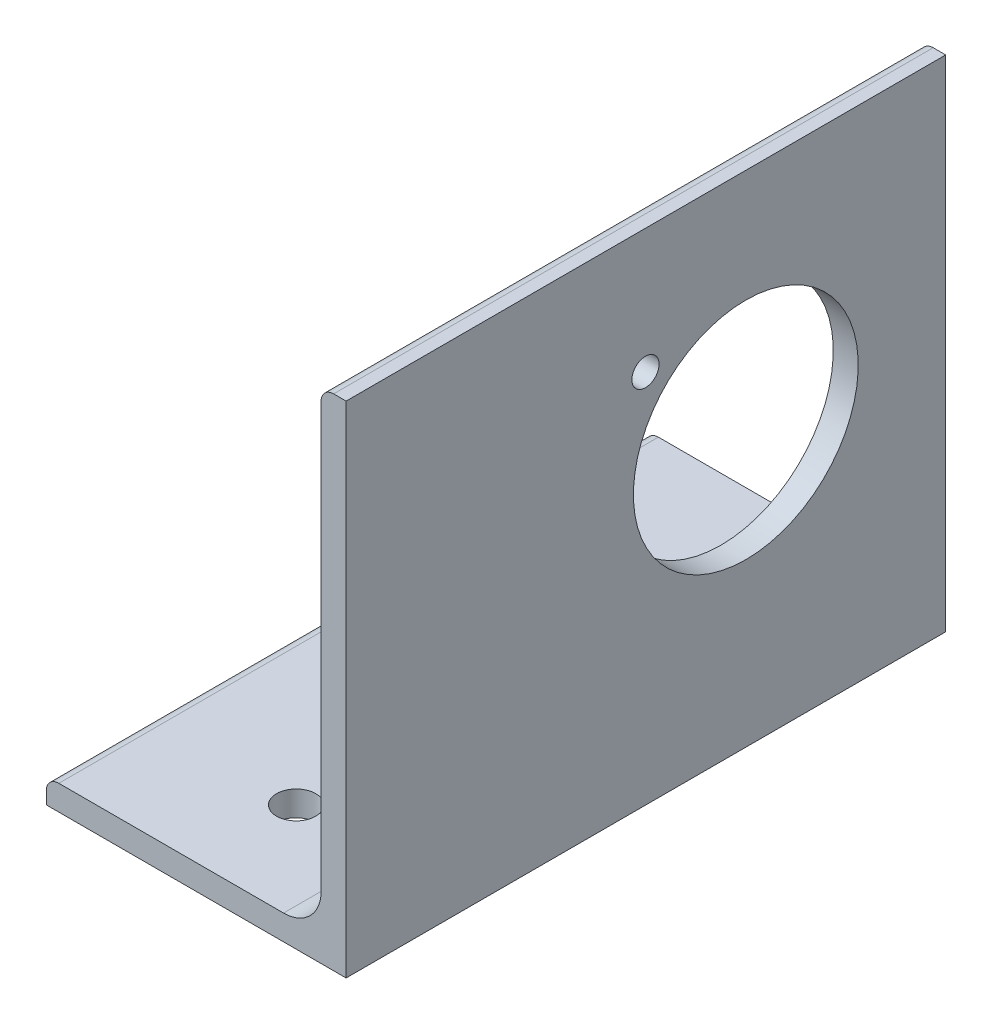
ISO-10303-21;
HEADER;
FILE_DESCRIPTION(('STEP AP214'),'2;1');
FILE_NAME('part.step','',(''),(''),'','','');
FILE_SCHEMA(('AUTOMOTIVE_DESIGN { 1 0 10303 214 1 1 1 1 }'));
ENDSEC;
DATA;
#1=APPLICATION_CONTEXT('core data for automotive mechanical design processes');
#2=APPLICATION_PROTOCOL_DEFINITION('international standard','automotive_design',2000,#1);
#3=PRODUCT_CONTEXT('',#1,'mechanical');
#4=PRODUCT('Part','Part','',(#3));
#5=PRODUCT_RELATED_PRODUCT_CATEGORY('part','',(#4));
#6=PRODUCT_DEFINITION_FORMATION('','',#4);
#7=PRODUCT_DEFINITION_CONTEXT('part definition',#1,'design');
#8=PRODUCT_DEFINITION('design','',#6,#7);
#9=PRODUCT_DEFINITION_SHAPE('','',#8);
#10=(LENGTH_UNIT() NAMED_UNIT(*) SI_UNIT(.MILLI.,.METRE.));
#11=(NAMED_UNIT(*) PLANE_ANGLE_UNIT() SI_UNIT($,.RADIAN.));
#12=(NAMED_UNIT(*) SI_UNIT($,.STERADIAN.) SOLID_ANGLE_UNIT());
#13=UNCERTAINTY_MEASURE_WITH_UNIT(LENGTH_MEASURE(1.E-05),#10,'distance_accuracy_value','');
#14=(GEOMETRIC_REPRESENTATION_CONTEXT(3) GLOBAL_UNCERTAINTY_ASSIGNED_CONTEXT((#13)) GLOBAL_UNIT_ASSIGNED_CONTEXT((#10,
#11,#12)) REPRESENTATION_CONTEXT('',''));
#15=CARTESIAN_POINT('',(0.,0.,0.));
#16=DIRECTION('',(0.,0.,1.));
#17=DIRECTION('',(1.,0.,0.));
#18=AXIS2_PLACEMENT_3D('',#15,#16,#17);
#19=CARTESIAN_POINT('',(-19.05,-30.1625,38.1));
#20=DIRECTION('',(1.,0.,0.));
#21=DIRECTION('',(0.,0.,-1.));
#22=AXIS2_PLACEMENT_3D('',#19,#20,#21);
#23=PLANE('',#22);
#24=DIRECTION('',(0.,-1.,0.));
#25=VECTOR('',#24,1.);
#26=CARTESIAN_POINT('',(-19.05,-30.1625,-38.1));
#27=LINE('',#26,#25);
#28=CARTESIAN_POINT('',(-19.05,-30.1625,-38.1));
#29=VERTEX_POINT('',#28);
#30=CARTESIAN_POINT('',(-19.05,-31.75,-38.1));
#31=VERTEX_POINT('',#30);
#32=EDGE_CURVE('E147',#29,#31,#27,.T.);
#33=ORIENTED_EDGE('',*,*,#32,.T.);
#34=DIRECTION('',(0.,0.,-1.));
#35=VECTOR('',#34,1.);
#36=CARTESIAN_POINT('',(-19.05,-31.75,38.1));
#37=LINE('',#36,#35);
#38=CARTESIAN_POINT('',(-19.05,-31.75,38.1));
#39=VERTEX_POINT('',#38);
#40=EDGE_CURVE('E11',#39,#31,#37,.T.);
#41=ORIENTED_EDGE('',*,*,#40,.F.);
#42=DIRECTION('',(0.,-1.,0.));
#43=VECTOR('',#42,1.);
#44=CARTESIAN_POINT('',(-19.05,-30.1625,38.1));
#45=LINE('',#44,#43);
#46=CARTESIAN_POINT('',(-19.05,-30.1625,38.1));
#47=VERTEX_POINT('',#46);
#48=EDGE_CURVE('E164',#47,#39,#45,.T.);
#49=ORIENTED_EDGE('',*,*,#48,.F.);
#50=DIRECTION('',(0.,0.,-1.));
#51=VECTOR('',#50,1.);
#52=CARTESIAN_POINT('',(-19.05,-30.1625,38.1));
#53=LINE('',#52,#51);
#54=EDGE_CURVE('E143',#47,#29,#53,.T.);
#55=ORIENTED_EDGE('',*,*,#54,.T.);
#56=EDGE_LOOP('',(#33,#41,#49,#55));
#57=FACE_BOUND('',#56,.T.);
#58=ADVANCED_FACE('F43',(#57),#23,.F.);
#59=CARTESIAN_POINT('',(-19.05,-31.75,38.1));
#60=DIRECTION('',(0.,1.,0.));
#61=DIRECTION('',(-1.,0.,0.));
#62=AXIS2_PLACEMENT_3D('',#59,#60,#61);
#63=PLANE('',#62);
#64=CARTESIAN_POINT('',(0.,-31.75,25.4));
#65=DIRECTION('',(0.,-1.,0.));
#66=DIRECTION('',(1.,0.,0.));
#67=AXIS2_PLACEMENT_3D('',#64,#65,#66);
#68=CIRCLE('',#67,2.4892);
#69=CARTESIAN_POINT('',(2.4892,-31.75,25.4));
#70=VERTEX_POINT('',#69);
#71=EDGE_CURVE('E180',#70,#70,#68,.T.);
#72=ORIENTED_EDGE('',*,*,#71,.F.);
#73=EDGE_LOOP('',(#72));
#74=FACE_BOUND('',#73,.T.);
#75=CARTESIAN_POINT('',(0.,-31.75,0.));
#76=DIRECTION('',(0.,-1.,0.));
#77=DIRECTION('',(1.,0.,0.));
#78=AXIS2_PLACEMENT_3D('',#75,#76,#77);
#79=CIRCLE('',#78,2.4892);
#80=CARTESIAN_POINT('',(2.4892,-31.75,0.));
#81=VERTEX_POINT('',#80);
#82=EDGE_CURVE('E186',#81,#81,#79,.T.);
#83=ORIENTED_EDGE('',*,*,#82,.F.);
#84=EDGE_LOOP('',(#83));
#85=FACE_BOUND('',#84,.T.);
#86=DIRECTION('',(1.,0.,0.));
#87=VECTOR('',#86,1.);
#88=CARTESIAN_POINT('',(-19.05,-31.75,-38.1));
#89=LINE('',#88,#87);
#90=CARTESIAN_POINT('',(19.05,-31.75,-38.1));
#91=VERTEX_POINT('',#90);
#92=EDGE_CURVE('E150',#31,#91,#89,.T.);
#93=ORIENTED_EDGE('',*,*,#92,.T.);
#94=DIRECTION('',(0.,0.,-1.));
#95=VECTOR('',#94,1.);
#96=CARTESIAN_POINT('',(19.05,-31.75,38.1));
#97=LINE('',#96,#95);
#98=CARTESIAN_POINT('',(19.05,-31.75,38.1));
#99=VERTEX_POINT('',#98);
#100=EDGE_CURVE('E52',#99,#91,#97,.T.);
#101=ORIENTED_EDGE('',*,*,#100,.F.);
#102=DIRECTION('',(1.,0.,0.));
#103=VECTOR('',#102,1.);
#104=CARTESIAN_POINT('',(-19.05,-31.75,38.1));
#105=LINE('',#104,#103);
#106=EDGE_CURVE('E107',#39,#99,#105,.T.);
#107=ORIENTED_EDGE('',*,*,#106,.F.);
#108=ORIENTED_EDGE('',*,*,#40,.T.);
#109=EDGE_LOOP('',(#93,#101,#107,#108));
#110=FACE_BOUND('',#109,.T.);
#111=ADVANCED_FACE('F239',(#74,#85,#110),#63,.F.);
#112=CARTESIAN_POINT('',(19.05,-31.75,38.1));
#113=DIRECTION('',(-1.,0.,0.));
#114=DIRECTION('',(0.,-1.,0.));
#115=AXIS2_PLACEMENT_3D('',#112,#113,#114);
#116=PLANE('',#115);
#117=CARTESIAN_POINT('',(19.05,15.9301386919437,0.0519634934806994));
#118=DIRECTION('',(-1.,0.,0.));
#119=DIRECTION('',(0.,-1.,0.));
#120=AXIS2_PLACEMENT_3D('',#117,#118,#119);
#121=CIRCLE('',#120,1.7272);
#122=CARTESIAN_POINT('',(19.05,14.2029386919437,0.0519634934806994));
#123=VERTEX_POINT('',#122);
#124=EDGE_CURVE('E184',#123,#123,#121,.T.);
#125=ORIENTED_EDGE('',*,*,#124,.T.);
#126=EDGE_LOOP('',(#125));
#127=FACE_BOUND('',#126,.T.);
#128=CARTESIAN_POINT('',(19.05,3.17817500002554,-12.7000001984375));
#129=DIRECTION('',(-1.,0.,0.));
#130=DIRECTION('',(0.,-1.,0.));
#131=AXIS2_PLACEMENT_3D('',#128,#129,#130);
#132=CIRCLE('',#131,14.2875);
#133=CARTESIAN_POINT('',(19.05,-11.1093249999745,-12.7000001984375));
#134=VERTEX_POINT('',#133);
#135=EDGE_CURVE('E151',#134,#134,#132,.T.);
#136=ORIENTED_EDGE('',*,*,#135,.T.);
#137=EDGE_LOOP('',(#136));
#138=FACE_BOUND('',#137,.T.);
#139=DIRECTION('',(0.,1.,0.));
#140=VECTOR('',#139,1.);
#141=CARTESIAN_POINT('',(19.05,-31.75,-38.1));
#142=LINE('',#141,#140);
#143=CARTESIAN_POINT('',(19.05,31.75,-38.1));
#144=VERTEX_POINT('',#143);
#145=EDGE_CURVE('E153',#91,#144,#142,.T.);
#146=ORIENTED_EDGE('',*,*,#145,.T.);
#147=DIRECTION('',(0.,0.,-1.));
#148=VECTOR('',#147,1.);
#149=CARTESIAN_POINT('',(19.05,31.75,38.1));
#150=LINE('',#149,#148);
#151=CARTESIAN_POINT('',(19.05,31.75,38.1));
#152=VERTEX_POINT('',#151);
#153=EDGE_CURVE('E174',#152,#144,#150,.T.);
#154=ORIENTED_EDGE('',*,*,#153,.F.);
#155=DIRECTION('',(0.,1.,0.));
#156=VECTOR('',#155,1.);
#157=CARTESIAN_POINT('',(19.05,-31.75,38.1));
#158=LINE('',#157,#156);
#159=EDGE_CURVE('E205',#99,#152,#158,.T.);
#160=ORIENTED_EDGE('',*,*,#159,.F.);
#161=ORIENTED_EDGE('',*,*,#100,.T.);
#162=EDGE_LOOP('',(#146,#154,#160,#161));
#163=FACE_BOUND('',#162,.T.);
#164=ADVANCED_FACE('F243',(#127,#138,#163),#116,.F.);
#165=CARTESIAN_POINT('',(17.4625,31.75,38.1));
#166=DIRECTION('',(0.,-1.,0.));
#167=DIRECTION('',(1.,0.,0.));
#168=AXIS2_PLACEMENT_3D('',#165,#166,#167);
#169=PLANE('',#168);
#170=DIRECTION('',(-1.,0.,0.));
#171=VECTOR('',#170,1.);
#172=CARTESIAN_POINT('',(17.4625,31.75,-38.1));
#173=LINE('',#172,#171);
#174=CARTESIAN_POINT('',(17.4625,31.75,-38.1));
#175=VERTEX_POINT('',#174);
#176=EDGE_CURVE('E155',#144,#175,#173,.T.);
#177=ORIENTED_EDGE('',*,*,#176,.T.);
#178=DIRECTION('',(0.,0.,-1.));
#179=VECTOR('',#178,1.);
#180=CARTESIAN_POINT('',(17.4625,31.75,38.1));
#181=LINE('',#180,#179);
#182=CARTESIAN_POINT('',(17.4625,31.75,38.1));
#183=VERTEX_POINT('',#182);
#184=EDGE_CURVE('E171',#183,#175,#181,.T.);
#185=ORIENTED_EDGE('',*,*,#184,.F.);
#186=DIRECTION('',(-1.,0.,0.));
#187=VECTOR('',#186,1.);
#188=CARTESIAN_POINT('',(17.4625,31.75,38.1));
#189=LINE('',#188,#187);
#190=EDGE_CURVE('E207',#152,#183,#189,.T.);
#191=ORIENTED_EDGE('',*,*,#190,.F.);
#192=ORIENTED_EDGE('',*,*,#153,.T.);
#193=EDGE_LOOP('',(#177,#185,#191,#192));
#194=FACE_BOUND('',#193,.T.);
#195=ADVANCED_FACE('F248',(#194),#169,.F.);
#196=CARTESIAN_POINT('',(17.4625,30.1625,38.1));
#197=DIRECTION('',(0.,0.,-1.));
#198=DIRECTION('',(-1.,0.,0.));
#199=AXIS2_PLACEMENT_3D('',#196,#197,#198);
#200=CYLINDRICAL_SURFACE('',#199,1.5875);
#201=CARTESIAN_POINT('',(17.4625,30.1625,-38.1));
#202=DIRECTION('',(0.,0.,1.));
#203=DIRECTION('',(-1.,0.,0.));
#204=AXIS2_PLACEMENT_3D('',#201,#202,#203);
#205=CIRCLE('',#204,1.5875);
#206=CARTESIAN_POINT('',(15.875,30.1625,-38.1));
#207=VERTEX_POINT('',#206);
#208=EDGE_CURVE('E157',#175,#207,#205,.T.);
#209=ORIENTED_EDGE('',*,*,#208,.T.);
#210=DIRECTION('',(0.,0.,-1.));
#211=VECTOR('',#210,1.);
#212=CARTESIAN_POINT('',(15.875,30.1625,38.1));
#213=LINE('',#212,#211);
#214=CARTESIAN_POINT('',(15.875,30.1625,38.1));
#215=VERTEX_POINT('',#214);
#216=EDGE_CURVE('E168',#215,#207,#213,.T.);
#217=ORIENTED_EDGE('',*,*,#216,.F.);
#218=CARTESIAN_POINT('',(17.4625,30.1625,38.1));
#219=DIRECTION('',(0.,0.,1.));
#220=DIRECTION('',(-1.,0.,0.));
#221=AXIS2_PLACEMENT_3D('',#218,#219,#220);
#222=CIRCLE('',#221,1.5875);
#223=EDGE_CURVE('E209',#183,#215,#222,.T.);
#224=ORIENTED_EDGE('',*,*,#223,.F.);
#225=ORIENTED_EDGE('',*,*,#184,.T.);
#226=EDGE_LOOP('',(#209,#217,#224,#225));
#227=FACE_BOUND('',#226,.T.);
#228=ADVANCED_FACE('F215',(#227),#200,.T.);
#229=CARTESIAN_POINT('',(15.875,30.1625,38.1));
#230=DIRECTION('',(1.,0.,0.));
#231=DIRECTION('',(0.,1.,0.));
#232=AXIS2_PLACEMENT_3D('',#229,#230,#231);
#233=PLANE('',#232);
#234=CARTESIAN_POINT('',(15.875,15.9301386919437,0.0519634934806994));
#235=DIRECTION('',(-1.,0.,0.));
#236=DIRECTION('',(0.,-1.,0.));
#237=AXIS2_PLACEMENT_3D('',#234,#235,#236);
#238=CIRCLE('',#237,1.7272);
#239=CARTESIAN_POINT('',(15.875,14.2029386919437,0.0519634934806994));
#240=VERTEX_POINT('',#239);
#241=EDGE_CURVE('E193',#240,#240,#238,.T.);
#242=ORIENTED_EDGE('',*,*,#241,.F.);
#243=EDGE_LOOP('',(#242));
#244=FACE_BOUND('',#243,.T.);
#245=CARTESIAN_POINT('',(15.875,3.17817500002554,-12.7000001984375));
#246=DIRECTION('',(-1.,0.,0.));
#247=DIRECTION('',(0.,-1.,0.));
#248=AXIS2_PLACEMENT_3D('',#245,#246,#247);
#249=CIRCLE('',#248,14.2875);
#250=CARTESIAN_POINT('',(15.875,-11.1093249999745,-12.7000001984375));
#251=VERTEX_POINT('',#250);
#252=EDGE_CURVE('E196',#251,#251,#249,.T.);
#253=ORIENTED_EDGE('',*,*,#252,.F.);
#254=EDGE_LOOP('',(#253));
#255=FACE_BOUND('',#254,.T.);
#256=DIRECTION('',(0.,-1.,0.));
#257=VECTOR('',#256,1.);
#258=CARTESIAN_POINT('',(15.875,30.1625,-38.1));
#259=LINE('',#258,#257);
#260=CARTESIAN_POINT('',(15.875,-23.7998,-38.1));
#261=VERTEX_POINT('',#260);
#262=EDGE_CURVE('E159',#207,#261,#259,.T.);
#263=ORIENTED_EDGE('',*,*,#262,.T.);
#264=DIRECTION('',(0.,0.,-1.));
#265=VECTOR('',#264,1.);
#266=CARTESIAN_POINT('',(15.875,-23.7998,38.1));
#267=LINE('',#266,#265);
#268=CARTESIAN_POINT('',(15.875,-23.7998,38.1));
#269=VERTEX_POINT('',#268);
#270=EDGE_CURVE('E138',#269,#261,#267,.T.);
#271=ORIENTED_EDGE('',*,*,#270,.F.);
#272=DIRECTION('',(0.,-1.,0.));
#273=VECTOR('',#272,1.);
#274=CARTESIAN_POINT('',(15.875,30.1625,38.1));
#275=LINE('',#274,#273);
#276=EDGE_CURVE('E129',#215,#269,#275,.T.);
#277=ORIENTED_EDGE('',*,*,#276,.F.);
#278=ORIENTED_EDGE('',*,*,#216,.T.);
#279=EDGE_LOOP('',(#263,#271,#277,#278));
#280=FACE_BOUND('',#279,.T.);
#281=ADVANCED_FACE('F219',(#244,#255,#280),#233,.F.);
#282=CARTESIAN_POINT('',(11.0998,-23.7998,38.1));
#283=DIRECTION('',(0.,0.,-1.));
#284=DIRECTION('',(-1.,0.,0.));
#285=AXIS2_PLACEMENT_3D('',#282,#283,#284);
#286=CYLINDRICAL_SURFACE('',#285,4.7752);
#287=CARTESIAN_POINT('',(11.0998,-23.7998,-38.1));
#288=DIRECTION('',(0.,0.,-1.));
#289=DIRECTION('',(-1.,0.,0.));
#290=AXIS2_PLACEMENT_3D('',#287,#288,#289);
#291=CIRCLE('',#290,4.7752);
#292=CARTESIAN_POINT('',(11.0998,-28.575,-38.1));
#293=VERTEX_POINT('',#292);
#294=EDGE_CURVE('E137',#261,#293,#291,.T.);
#295=ORIENTED_EDGE('',*,*,#294,.T.);
#296=DIRECTION('',(0.,0.,-1.));
#297=VECTOR('',#296,1.);
#298=CARTESIAN_POINT('',(11.0998,-28.575,38.1));
#299=LINE('',#298,#297);
#300=CARTESIAN_POINT('',(11.0998,-28.575,38.1));
#301=VERTEX_POINT('',#300);
#302=EDGE_CURVE('E134',#301,#293,#299,.T.);
#303=ORIENTED_EDGE('',*,*,#302,.F.);
#304=CARTESIAN_POINT('',(11.0998,-23.7998,38.1));
#305=DIRECTION('',(0.,0.,-1.));
#306=DIRECTION('',(-1.,0.,0.));
#307=AXIS2_PLACEMENT_3D('',#304,#305,#306);
#308=CIRCLE('',#307,4.7752);
#309=EDGE_CURVE('E123',#269,#301,#308,.T.);
#310=ORIENTED_EDGE('',*,*,#309,.F.);
#311=ORIENTED_EDGE('',*,*,#270,.T.);
#312=EDGE_LOOP('',(#295,#303,#310,#311));
#313=FACE_BOUND('',#312,.T.);
#314=ADVANCED_FACE('F135',(#313),#286,.F.);
#315=CARTESIAN_POINT('',(11.0998,-28.575,38.1));
#316=DIRECTION('',(0.,-1.,0.));
#317=DIRECTION('',(1.,0.,0.));
#318=AXIS2_PLACEMENT_3D('',#315,#316,#317);
#319=PLANE('',#318);
#320=CARTESIAN_POINT('',(0.,-28.575,25.4));
#321=DIRECTION('',(0.,-1.,0.));
#322=DIRECTION('',(1.,0.,0.));
#323=AXIS2_PLACEMENT_3D('',#320,#321,#322);
#324=CIRCLE('',#323,2.4892);
#325=CARTESIAN_POINT('',(2.4892,-28.575,25.4));
#326=VERTEX_POINT('',#325);
#327=EDGE_CURVE('E46',#326,#326,#324,.T.);
#328=ORIENTED_EDGE('',*,*,#327,.T.);
#329=EDGE_LOOP('',(#328));
#330=FACE_BOUND('',#329,.T.);
#331=CARTESIAN_POINT('',(0.,-28.575,0.));
#332=DIRECTION('',(0.,-1.,0.));
#333=DIRECTION('',(1.,0.,0.));
#334=AXIS2_PLACEMENT_3D('',#331,#332,#333);
#335=CIRCLE('',#334,2.4892);
#336=CARTESIAN_POINT('',(2.4892,-28.575,0.));
#337=VERTEX_POINT('',#336);
#338=EDGE_CURVE('E178',#337,#337,#335,.T.);
#339=ORIENTED_EDGE('',*,*,#338,.T.);
#340=EDGE_LOOP('',(#339));
#341=FACE_BOUND('',#340,.T.);
#342=DIRECTION('',(-1.,0.,0.));
#343=VECTOR('',#342,1.);
#344=CARTESIAN_POINT('',(11.0998,-28.575,-38.1));
#345=LINE('',#344,#343);
#346=CARTESIAN_POINT('',(-17.4625,-28.575,-38.1));
#347=VERTEX_POINT('',#346);
#348=EDGE_CURVE('E93',#293,#347,#345,.T.);
#349=ORIENTED_EDGE('',*,*,#348,.T.);
#350=DIRECTION('',(0.,0.,-1.));
#351=VECTOR('',#350,1.);
#352=CARTESIAN_POINT('',(-17.4625,-28.575,38.1));
#353=LINE('',#352,#351);
#354=CARTESIAN_POINT('',(-17.4625,-28.575,38.1));
#355=VERTEX_POINT('',#354);
#356=EDGE_CURVE('E139',#355,#347,#353,.T.);
#357=ORIENTED_EDGE('',*,*,#356,.F.);
#358=DIRECTION('',(-1.,0.,0.));
#359=VECTOR('',#358,1.);
#360=CARTESIAN_POINT('',(11.0998,-28.575,38.1));
#361=LINE('',#360,#359);
#362=EDGE_CURVE('E127',#301,#355,#361,.T.);
#363=ORIENTED_EDGE('',*,*,#362,.F.);
#364=ORIENTED_EDGE('',*,*,#302,.T.);
#365=EDGE_LOOP('',(#349,#357,#363,#364));
#366=FACE_BOUND('',#365,.T.);
#367=ADVANCED_FACE('F141',(#330,#341,#366),#319,.F.);
#368=CARTESIAN_POINT('',(-17.4625,-30.1625,38.1));
#369=DIRECTION('',(0.,0.,-1.));
#370=DIRECTION('',(-1.,0.,0.));
#371=AXIS2_PLACEMENT_3D('',#368,#369,#370);
#372=CYLINDRICAL_SURFACE('',#371,1.5875);
#373=CARTESIAN_POINT('',(-17.4625,-30.1625,-38.1));
#374=DIRECTION('',(0.,0.,1.));
#375=DIRECTION('',(-1.,0.,0.));
#376=AXIS2_PLACEMENT_3D('',#373,#374,#375);
#377=CIRCLE('',#376,1.5875);
#378=EDGE_CURVE('E99',#347,#29,#377,.T.);
#379=ORIENTED_EDGE('',*,*,#378,.T.);
#380=ORIENTED_EDGE('',*,*,#54,.F.);
#381=CARTESIAN_POINT('',(-17.4625,-30.1625,38.1));
#382=DIRECTION('',(0.,0.,1.));
#383=DIRECTION('',(-1.,0.,0.));
#384=AXIS2_PLACEMENT_3D('',#381,#382,#383);
#385=CIRCLE('',#384,1.5875);
#386=EDGE_CURVE('E61',#355,#47,#385,.T.);
#387=ORIENTED_EDGE('',*,*,#386,.F.);
#388=ORIENTED_EDGE('',*,*,#356,.T.);
#389=EDGE_LOOP('',(#379,#380,#387,#388));
#390=FACE_BOUND('',#389,.T.);
#391=ADVANCED_FACE('F227',(#390),#372,.T.);
#392=CARTESIAN_POINT('',(17.4625,30.1625,38.1));
#393=DIRECTION('',(0.,0.,-1.));
#394=DIRECTION('',(-1.,0.,0.));
#395=AXIS2_PLACEMENT_3D('',#392,#393,#394);
#396=PLANE('',#395);
#397=ORIENTED_EDGE('',*,*,#48,.T.);
#398=ORIENTED_EDGE('',*,*,#106,.T.);
#399=ORIENTED_EDGE('',*,*,#159,.T.);
#400=ORIENTED_EDGE('',*,*,#190,.T.);
#401=ORIENTED_EDGE('',*,*,#223,.T.);
#402=ORIENTED_EDGE('',*,*,#276,.T.);
#403=ORIENTED_EDGE('',*,*,#309,.T.);
#404=ORIENTED_EDGE('',*,*,#362,.T.);
#405=ORIENTED_EDGE('',*,*,#386,.T.);
#406=EDGE_LOOP('',(#397,#398,#399,#400,#401,#402,#403,#404,#405));
#407=FACE_BOUND('',#406,.T.);
#408=ADVANCED_FACE('F125',(#407),#396,.F.);
#409=CARTESIAN_POINT('',(17.4625,30.1625,-38.1));
#410=DIRECTION('',(0.,0.,-1.));
#411=DIRECTION('',(-1.,0.,0.));
#412=AXIS2_PLACEMENT_3D('',#409,#410,#411);
#413=PLANE('',#412);
#414=ORIENTED_EDGE('',*,*,#32,.F.);
#415=ORIENTED_EDGE('',*,*,#378,.F.);
#416=ORIENTED_EDGE('',*,*,#348,.F.);
#417=ORIENTED_EDGE('',*,*,#294,.F.);
#418=ORIENTED_EDGE('',*,*,#262,.F.);
#419=ORIENTED_EDGE('',*,*,#208,.F.);
#420=ORIENTED_EDGE('',*,*,#176,.F.);
#421=ORIENTED_EDGE('',*,*,#145,.F.);
#422=ORIENTED_EDGE('',*,*,#92,.F.);
#423=EDGE_LOOP('',(#414,#415,#416,#417,#418,#419,#420,#421,#422));
#424=FACE_BOUND('',#423,.T.);
#425=ADVANCED_FACE('F222',(#424),#413,.T.);
#426=CARTESIAN_POINT('',(19.05,3.17817500002554,-12.7000001984375));
#427=DIRECTION('',(-1.,0.,0.));
#428=DIRECTION('',(0.,-1.,0.));
#429=AXIS2_PLACEMENT_3D('',#426,#427,#428);
#430=CYLINDRICAL_SURFACE('',#429,14.2875);
#431=ORIENTED_EDGE('',*,*,#135,.F.);
#432=EDGE_LOOP('',(#431));
#433=FACE_BOUND('',#432,.T.);
#434=ORIENTED_EDGE('',*,*,#252,.T.);
#435=EDGE_LOOP('',(#434));
#436=FACE_BOUND('',#435,.T.);
#437=ADVANCED_FACE('F309',(#433,#436),#430,.F.);
#438=CARTESIAN_POINT('',(19.05,15.9301386919437,0.0519634934806994));
#439=DIRECTION('',(-1.,0.,0.));
#440=DIRECTION('',(0.,-1.,0.));
#441=AXIS2_PLACEMENT_3D('',#438,#439,#440);
#442=CYLINDRICAL_SURFACE('',#441,1.7272);
#443=ORIENTED_EDGE('',*,*,#124,.F.);
#444=EDGE_LOOP('',(#443));
#445=FACE_BOUND('',#444,.T.);
#446=ORIENTED_EDGE('',*,*,#241,.T.);
#447=EDGE_LOOP('',(#446));
#448=FACE_BOUND('',#447,.T.);
#449=ADVANCED_FACE('F287',(#445,#448),#442,.F.);
#450=CARTESIAN_POINT('',(0.,31.75,0.));
#451=DIRECTION('',(0.,-1.,0.));
#452=DIRECTION('',(1.,0.,0.));
#453=AXIS2_PLACEMENT_3D('',#450,#451,#452);
#454=CYLINDRICAL_SURFACE('',#453,2.4892);
#455=ORIENTED_EDGE('',*,*,#82,.T.);
#456=EDGE_LOOP('',(#455));
#457=FACE_BOUND('',#456,.T.);
#458=ORIENTED_EDGE('',*,*,#338,.F.);
#459=EDGE_LOOP('',(#458));
#460=FACE_BOUND('',#459,.T.);
#461=ADVANCED_FACE('F281',(#457,#460),#454,.F.);
#462=CARTESIAN_POINT('',(0.,31.75,25.4));
#463=DIRECTION('',(0.,-1.,0.));
#464=DIRECTION('',(1.,0.,0.));
#465=AXIS2_PLACEMENT_3D('',#462,#463,#464);
#466=CYLINDRICAL_SURFACE('',#465,2.4892);
#467=ORIENTED_EDGE('',*,*,#71,.T.);
#468=EDGE_LOOP('',(#467));
#469=FACE_BOUND('',#468,.T.);
#470=ORIENTED_EDGE('',*,*,#327,.F.);
#471=EDGE_LOOP('',(#470));
#472=FACE_BOUND('',#471,.T.);
#473=ADVANCED_FACE('F286',(#469,#472),#466,.F.);
#474=CLOSED_SHELL('',(#58,#111,#164,#195,#228,#281,#314,#367,#391,#408,#425,#437,#449,#461,#473));
#475=MANIFOLD_SOLID_BREP('B2',#474);
#476=ADVANCED_BREP_SHAPE_REPRESENTATION('',(#18,#475),#14);
#477=SHAPE_DEFINITION_REPRESENTATION(#9,#476);
ENDSEC;
END-ISO-10303-21;
